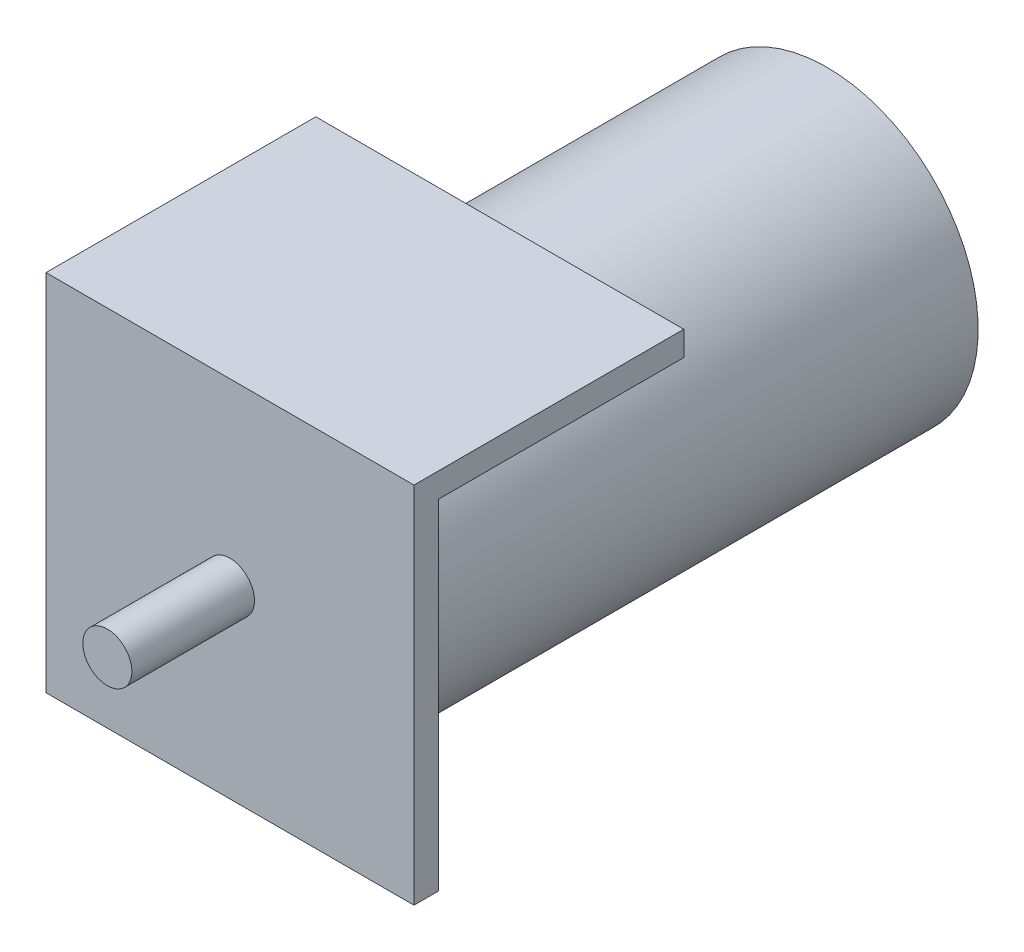
ISO-10303-21;
HEADER;
FILE_DESCRIPTION(('STEP AP214'),'2;1');
FILE_NAME('part.step','',(''),(''),'','','');
FILE_SCHEMA(('AUTOMOTIVE_DESIGN { 1 0 10303 214 1 1 1 1 }'));
ENDSEC;
DATA;
#1=APPLICATION_CONTEXT('core data for automotive mechanical design processes');
#2=APPLICATION_PROTOCOL_DEFINITION('international standard','automotive_design',2000,#1);
#3=PRODUCT_CONTEXT('',#1,'mechanical');
#4=PRODUCT('Part','Part','',(#3));
#5=PRODUCT_RELATED_PRODUCT_CATEGORY('part','',(#4));
#6=PRODUCT_DEFINITION_FORMATION('','',#4);
#7=PRODUCT_DEFINITION_CONTEXT('part definition',#1,'design');
#8=PRODUCT_DEFINITION('design','',#6,#7);
#9=PRODUCT_DEFINITION_SHAPE('','',#8);
#10=(LENGTH_UNIT() NAMED_UNIT(*) SI_UNIT(.MILLI.,.METRE.));
#11=(NAMED_UNIT(*) PLANE_ANGLE_UNIT() SI_UNIT($,.RADIAN.));
#12=(NAMED_UNIT(*) SI_UNIT($,.STERADIAN.) SOLID_ANGLE_UNIT());
#13=UNCERTAINTY_MEASURE_WITH_UNIT(LENGTH_MEASURE(1.E-05),#10,'distance_accuracy_value','');
#14=(GEOMETRIC_REPRESENTATION_CONTEXT(3) GLOBAL_UNCERTAINTY_ASSIGNED_CONTEXT((#13)) GLOBAL_UNIT_ASSIGNED_CONTEXT((#10,
#11,#12)) REPRESENTATION_CONTEXT('',''));
#15=CARTESIAN_POINT('',(0.,0.,0.));
#16=DIRECTION('',(0.,0.,1.));
#17=DIRECTION('',(1.,0.,0.));
#18=AXIS2_PLACEMENT_3D('',#15,#16,#17);
#19=CARTESIAN_POINT('',(22.5,-22.5,0.));
#20=DIRECTION('',(0.,0.,1.));
#21=DIRECTION('',(1.,0.,0.));
#22=AXIS2_PLACEMENT_3D('',#19,#20,#21);
#23=PLANE('',#22);
#24=CARTESIAN_POINT('',(0.,0.,0.));
#25=DIRECTION('',(0.,0.,1.));
#26=DIRECTION('',(1.,0.,0.));
#27=AXIS2_PLACEMENT_3D('',#24,#25,#26);
#28=CIRCLE('',#27,18.5);
#29=CARTESIAN_POINT('',(18.5,0.,0.));
#30=VERTEX_POINT('',#29);
#31=EDGE_CURVE('E142',#30,#30,#28,.T.);
#32=ORIENTED_EDGE('',*,*,#31,.T.);
#33=EDGE_LOOP('',(#32));
#34=FACE_BOUND('',#33,.T.);
#35=DIRECTION('',(-1.,0.,0.));
#36=VECTOR('',#35,1.);
#37=CARTESIAN_POINT('',(22.5,19.,0.));
#38=LINE('',#37,#36);
#39=CARTESIAN_POINT('',(22.5,19.,0.));
#40=VERTEX_POINT('',#39);
#41=CARTESIAN_POINT('',(-22.5,19.,0.));
#42=VERTEX_POINT('',#41);
#43=EDGE_CURVE('E11',#40,#42,#38,.T.);
#44=ORIENTED_EDGE('',*,*,#43,.F.);
#45=DIRECTION('',(0.,1.,0.));
#46=VECTOR('',#45,1.);
#47=CARTESIAN_POINT('',(22.5,-22.5,0.));
#48=LINE('',#47,#46);
#49=CARTESIAN_POINT('',(22.5,-22.5,0.));
#50=VERTEX_POINT('',#49);
#51=EDGE_CURVE('E105',#50,#40,#48,.T.);
#52=ORIENTED_EDGE('',*,*,#51,.F.);
#53=DIRECTION('',(-1.,0.,0.));
#54=VECTOR('',#53,1.);
#55=CARTESIAN_POINT('',(22.5,-22.5,0.));
#56=LINE('',#55,#54);
#57=CARTESIAN_POINT('',(-22.5,-22.5,0.));
#58=VERTEX_POINT('',#57);
#59=EDGE_CURVE('E137',#50,#58,#56,.T.);
#60=ORIENTED_EDGE('',*,*,#59,.T.);
#61=DIRECTION('',(0.,1.,0.));
#62=VECTOR('',#61,1.);
#63=CARTESIAN_POINT('',(-22.5,-22.5,0.));
#64=LINE('',#63,#62);
#65=EDGE_CURVE('E135',#58,#42,#64,.T.);
#66=ORIENTED_EDGE('',*,*,#65,.T.);
#67=EDGE_LOOP('',(#44,#52,#60,#66));
#68=FACE_BOUND('',#67,.T.);
#69=ADVANCED_FACE('F39',(#34,#68),#23,.F.);
#70=CARTESIAN_POINT('',(0.,0.,-75.));
#71=DIRECTION('',(0.,0.,-1.));
#72=DIRECTION('',(-1.,0.,0.));
#73=AXIS2_PLACEMENT_3D('',#70,#71,#72);
#74=CYLINDRICAL_SURFACE('',#73,3.);
#75=CARTESIAN_POINT('',(0.,0.,18.));
#76=DIRECTION('',(0.,0.,-1.));
#77=DIRECTION('',(-1.,0.,0.));
#78=AXIS2_PLACEMENT_3D('',#75,#76,#77);
#79=CIRCLE('',#78,3.);
#80=CARTESIAN_POINT('',(-3.,0.,18.));
#81=VERTEX_POINT('',#80);
#82=EDGE_CURVE('E146',#81,#81,#79,.T.);
#83=ORIENTED_EDGE('',*,*,#82,.T.);
#84=EDGE_LOOP('',(#83));
#85=FACE_BOUND('',#84,.T.);
#86=CARTESIAN_POINT('',(0.,0.,3.));
#87=DIRECTION('',(0.,0.,-1.));
#88=DIRECTION('',(-1.,0.,0.));
#89=AXIS2_PLACEMENT_3D('',#86,#87,#88);
#90=CIRCLE('',#89,3.);
#91=CARTESIAN_POINT('',(-3.,0.,3.));
#92=VERTEX_POINT('',#91);
#93=EDGE_CURVE('E50',#92,#92,#90,.T.);
#94=ORIENTED_EDGE('',*,*,#93,.F.);
#95=EDGE_LOOP('',(#94));
#96=FACE_BOUND('',#95,.T.);
#97=ADVANCED_FACE('F156',(#85,#96),#74,.T.);
#98=CARTESIAN_POINT('',(0.,0.,18.));
#99=DIRECTION('',(0.,0.,-1.));
#100=DIRECTION('',(-1.,0.,0.));
#101=AXIS2_PLACEMENT_3D('',#98,#99,#100);
#102=PLANE('',#101);
#103=ORIENTED_EDGE('',*,*,#82,.F.);
#104=EDGE_LOOP('',(#103));
#105=FACE_BOUND('',#104,.T.);
#106=ADVANCED_FACE('F41',(#105),#102,.F.);
#107=CARTESIAN_POINT('',(22.5,22.,3.));
#108=DIRECTION('',(0.,0.,-1.));
#109=DIRECTION('',(-1.,0.,0.));
#110=AXIS2_PLACEMENT_3D('',#107,#108,#109);
#111=PLANE('',#110);
#112=ORIENTED_EDGE('',*,*,#93,.T.);
#113=EDGE_LOOP('',(#112));
#114=FACE_BOUND('',#113,.T.);
#115=DIRECTION('',(-1.,0.,0.));
#116=VECTOR('',#115,1.);
#117=CARTESIAN_POINT('',(22.5,-22.5,3.));
#118=LINE('',#117,#116);
#119=CARTESIAN_POINT('',(22.5,-22.5,3.));
#120=VERTEX_POINT('',#119);
#121=CARTESIAN_POINT('',(-22.5,-22.5,3.));
#122=VERTEX_POINT('',#121);
#123=EDGE_CURVE('E139',#120,#122,#118,.T.);
#124=ORIENTED_EDGE('',*,*,#123,.F.);
#125=DIRECTION('',(0.,-1.,0.));
#126=VECTOR('',#125,1.);
#127=CARTESIAN_POINT('',(22.5,22.,3.));
#128=LINE('',#127,#126);
#129=CARTESIAN_POINT('',(22.5,22.,3.));
#130=VERTEX_POINT('',#129);
#131=EDGE_CURVE('E85',#130,#120,#128,.T.);
#132=ORIENTED_EDGE('',*,*,#131,.F.);
#133=DIRECTION('',(-1.,0.,0.));
#134=VECTOR('',#133,1.);
#135=CARTESIAN_POINT('',(22.5,22.,3.));
#136=LINE('',#135,#134);
#137=CARTESIAN_POINT('',(-22.5,22.,3.));
#138=VERTEX_POINT('',#137);
#139=EDGE_CURVE('E126',#130,#138,#136,.T.);
#140=ORIENTED_EDGE('',*,*,#139,.T.);
#141=DIRECTION('',(0.,-1.,0.));
#142=VECTOR('',#141,1.);
#143=CARTESIAN_POINT('',(-22.5,22.,3.));
#144=LINE('',#143,#142);
#145=EDGE_CURVE('E111',#138,#122,#144,.T.);
#146=ORIENTED_EDGE('',*,*,#145,.T.);
#147=EDGE_LOOP('',(#124,#132,#140,#146));
#148=FACE_BOUND('',#147,.T.);
#149=ADVANCED_FACE('F153',(#114,#148),#111,.F.);
#150=CARTESIAN_POINT('',(22.5,-22.5,3.));
#151=DIRECTION('',(0.,1.,0.));
#152=DIRECTION('',(0.,0.,1.));
#153=AXIS2_PLACEMENT_3D('',#150,#151,#152);
#154=PLANE('',#153);
#155=DIRECTION('',(0.,0.,-1.));
#156=VECTOR('',#155,1.);
#157=CARTESIAN_POINT('',(-22.5,-22.5,3.));
#158=LINE('',#157,#156);
#159=EDGE_CURVE('E128',#122,#58,#158,.T.);
#160=ORIENTED_EDGE('',*,*,#159,.T.);
#161=ORIENTED_EDGE('',*,*,#59,.F.);
#162=DIRECTION('',(0.,0.,-1.));
#163=VECTOR('',#162,1.);
#164=CARTESIAN_POINT('',(22.5,-22.5,3.));
#165=LINE('',#164,#163);
#166=EDGE_CURVE('E124',#120,#50,#165,.T.);
#167=ORIENTED_EDGE('',*,*,#166,.F.);
#168=ORIENTED_EDGE('',*,*,#123,.T.);
#169=EDGE_LOOP('',(#160,#161,#167,#168));
#170=FACE_BOUND('',#169,.T.);
#171=ADVANCED_FACE('F179',(#170),#154,.F.);
#172=CARTESIAN_POINT('',(22.5,22.,0.));
#173=DIRECTION('',(0.,-1.,0.));
#174=DIRECTION('',(0.,0.,-1.));
#175=AXIS2_PLACEMENT_3D('',#172,#173,#174);
#176=PLANE('',#175);
#177=DIRECTION('',(0.,0.,1.));
#178=VECTOR('',#177,1.);
#179=CARTESIAN_POINT('',(-22.5,22.,0.));
#180=LINE('',#179,#178);
#181=CARTESIAN_POINT('',(-22.5,22.,-30.));
#182=VERTEX_POINT('',#181);
#183=EDGE_CURVE('E76',#182,#138,#180,.T.);
#184=ORIENTED_EDGE('',*,*,#183,.T.);
#185=ORIENTED_EDGE('',*,*,#139,.F.);
#186=DIRECTION('',(0.,0.,1.));
#187=VECTOR('',#186,1.);
#188=CARTESIAN_POINT('',(22.5,22.,0.));
#189=LINE('',#188,#187);
#190=CARTESIAN_POINT('',(22.5,22.,-30.));
#191=VERTEX_POINT('',#190);
#192=EDGE_CURVE('E62',#191,#130,#189,.T.);
#193=ORIENTED_EDGE('',*,*,#192,.F.);
#194=DIRECTION('',(-1.,0.,0.));
#195=VECTOR('',#194,1.);
#196=CARTESIAN_POINT('',(22.5,22.,-30.));
#197=LINE('',#196,#195);
#198=EDGE_CURVE('E113',#191,#182,#197,.T.);
#199=ORIENTED_EDGE('',*,*,#198,.T.);
#200=EDGE_LOOP('',(#184,#185,#193,#199));
#201=FACE_BOUND('',#200,.T.);
#202=ADVANCED_FACE('F176',(#201),#176,.F.);
#203=CARTESIAN_POINT('',(22.5,0.,0.));
#204=DIRECTION('',(1.,0.,0.));
#205=DIRECTION('',(0.,0.,-1.));
#206=AXIS2_PLACEMENT_3D('',#203,#204,#205);
#207=PLANE('',#206);
#208=ORIENTED_EDGE('',*,*,#51,.T.);
#209=DIRECTION('',(0.,0.,-1.));
#210=VECTOR('',#209,1.);
#211=CARTESIAN_POINT('',(22.5,19.,3.));
#212=LINE('',#211,#210);
#213=CARTESIAN_POINT('',(22.5,19.,-30.));
#214=VERTEX_POINT('',#213);
#215=EDGE_CURVE('E96',#40,#214,#212,.T.);
#216=ORIENTED_EDGE('',*,*,#215,.T.);
#217=DIRECTION('',(0.,1.,0.));
#218=VECTOR('',#217,1.);
#219=CARTESIAN_POINT('',(22.5,19.,-30.));
#220=LINE('',#219,#218);
#221=EDGE_CURVE('E99',#214,#191,#220,.T.);
#222=ORIENTED_EDGE('',*,*,#221,.T.);
#223=ORIENTED_EDGE('',*,*,#192,.T.);
#224=ORIENTED_EDGE('',*,*,#131,.T.);
#225=ORIENTED_EDGE('',*,*,#166,.T.);
#226=EDGE_LOOP('',(#208,#216,#222,#223,#224,#225));
#227=FACE_BOUND('',#226,.T.);
#228=ADVANCED_FACE('F98',(#227),#207,.T.);
#229=CARTESIAN_POINT('',(-22.5,0.,0.));
#230=DIRECTION('',(1.,0.,0.));
#231=DIRECTION('',(0.,0.,-1.));
#232=AXIS2_PLACEMENT_3D('',#229,#230,#231);
#233=PLANE('',#232);
#234=ORIENTED_EDGE('',*,*,#159,.F.);
#235=ORIENTED_EDGE('',*,*,#145,.F.);
#236=ORIENTED_EDGE('',*,*,#183,.F.);
#237=DIRECTION('',(0.,1.,0.));
#238=VECTOR('',#237,1.);
#239=CARTESIAN_POINT('',(-22.5,19.,-30.));
#240=LINE('',#239,#238);
#241=CARTESIAN_POINT('',(-22.5,19.,-30.));
#242=VERTEX_POINT('',#241);
#243=EDGE_CURVE('E102',#242,#182,#240,.T.);
#244=ORIENTED_EDGE('',*,*,#243,.F.);
#245=DIRECTION('',(0.,0.,-1.));
#246=VECTOR('',#245,1.);
#247=CARTESIAN_POINT('',(-22.5,19.,3.));
#248=LINE('',#247,#246);
#249=EDGE_CURVE('E109',#42,#242,#248,.T.);
#250=ORIENTED_EDGE('',*,*,#249,.F.);
#251=ORIENTED_EDGE('',*,*,#65,.F.);
#252=EDGE_LOOP('',(#234,#235,#236,#244,#250,#251));
#253=FACE_BOUND('',#252,.T.);
#254=ADVANCED_FACE('F173',(#253),#233,.F.);
#255=CARTESIAN_POINT('',(18.5,0.,-70.));
#256=DIRECTION('',(0.,0.,1.));
#257=DIRECTION('',(1.,0.,0.));
#258=AXIS2_PLACEMENT_3D('',#255,#256,#257);
#259=PLANE('',#258);
#260=CARTESIAN_POINT('',(0.,0.,-70.));
#261=DIRECTION('',(0.,0.,-1.));
#262=DIRECTION('',(-1.,0.,0.));
#263=AXIS2_PLACEMENT_3D('',#260,#261,#262);
#264=CIRCLE('',#263,18.5);
#265=CARTESIAN_POINT('',(-18.5,0.,-70.));
#266=VERTEX_POINT('',#265);
#267=EDGE_CURVE('E144',#266,#266,#264,.T.);
#268=ORIENTED_EDGE('',*,*,#267,.T.);
#269=EDGE_LOOP('',(#268));
#270=FACE_BOUND('',#269,.T.);
#271=ADVANCED_FACE('F175',(#270),#259,.F.);
#272=CARTESIAN_POINT('',(0.,0.,-75.));
#273=DIRECTION('',(0.,0.,-1.));
#274=DIRECTION('',(-1.,0.,0.));
#275=AXIS2_PLACEMENT_3D('',#272,#273,#274);
#276=CYLINDRICAL_SURFACE('',#275,18.5);
#277=ORIENTED_EDGE('',*,*,#267,.F.);
#278=EDGE_LOOP('',(#277));
#279=FACE_BOUND('',#278,.T.);
#280=ORIENTED_EDGE('',*,*,#31,.F.);
#281=EDGE_LOOP('',(#280));
#282=FACE_BOUND('',#281,.T.);
#283=ADVANCED_FACE('F166',(#279,#282),#276,.T.);
#284=CARTESIAN_POINT('',(22.5,19.,3.));
#285=DIRECTION('',(0.,1.,0.));
#286=DIRECTION('',(0.,0.,1.));
#287=AXIS2_PLACEMENT_3D('',#284,#285,#286);
#288=PLANE('',#287);
#289=ORIENTED_EDGE('',*,*,#215,.F.);
#290=ORIENTED_EDGE('',*,*,#43,.T.);
#291=ORIENTED_EDGE('',*,*,#249,.T.);
#292=DIRECTION('',(-1.,0.,0.));
#293=VECTOR('',#292,1.);
#294=CARTESIAN_POINT('',(22.5,19.,-30.));
#295=LINE('',#294,#293);
#296=EDGE_CURVE('E110',#214,#242,#295,.T.);
#297=ORIENTED_EDGE('',*,*,#296,.F.);
#298=EDGE_LOOP('',(#289,#290,#291,#297));
#299=FACE_BOUND('',#298,.T.);
#300=ADVANCED_FACE('F107',(#299),#288,.F.);
#301=CARTESIAN_POINT('',(22.5,19.,-30.));
#302=DIRECTION('',(0.,0.,1.));
#303=DIRECTION('',(1.,0.,0.));
#304=AXIS2_PLACEMENT_3D('',#301,#302,#303);
#305=PLANE('',#304);
#306=ORIENTED_EDGE('',*,*,#243,.T.);
#307=ORIENTED_EDGE('',*,*,#198,.F.);
#308=ORIENTED_EDGE('',*,*,#221,.F.);
#309=ORIENTED_EDGE('',*,*,#296,.T.);
#310=EDGE_LOOP('',(#306,#307,#308,#309));
#311=FACE_BOUND('',#310,.T.);
#312=ADVANCED_FACE('F120',(#311),#305,.F.);
#313=CLOSED_SHELL('',(#69,#97,#106,#149,#171,#202,#228,#254,#271,#283,#300,#312));
#314=MANIFOLD_SOLID_BREP('B2',#313);
#315=ADVANCED_BREP_SHAPE_REPRESENTATION('',(#18,#314),#14);
#316=SHAPE_DEFINITION_REPRESENTATION(#9,#315);
ENDSEC;
END-ISO-10303-21;
